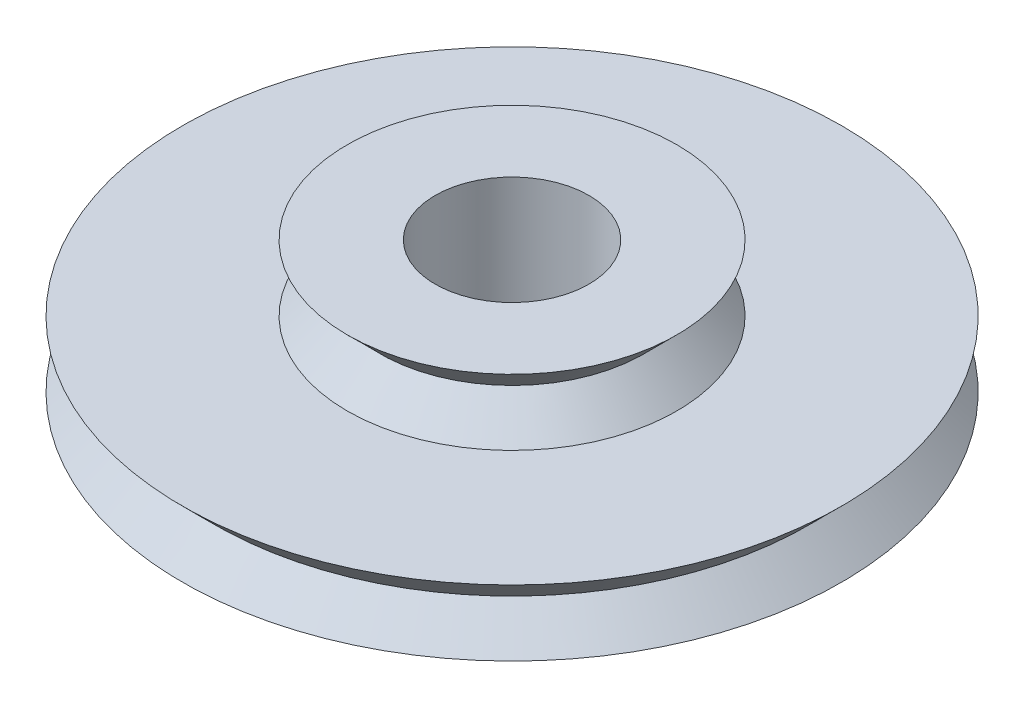
ISO-10303-21;
HEADER;
FILE_DESCRIPTION(('STEP AP214'),'2;1');
FILE_NAME('part.step','',(''),(''),'','','');
FILE_SCHEMA(('AUTOMOTIVE_DESIGN { 1 0 10303 214 1 1 1 1 }'));
ENDSEC;
DATA;
#1=APPLICATION_CONTEXT('core data for automotive mechanical design processes');
#2=APPLICATION_PROTOCOL_DEFINITION('international standard','automotive_design',2000,#1);
#3=PRODUCT_CONTEXT('',#1,'mechanical');
#4=PRODUCT('Part','Part','',(#3));
#5=PRODUCT_RELATED_PRODUCT_CATEGORY('part','',(#4));
#6=PRODUCT_DEFINITION_FORMATION('','',#4);
#7=PRODUCT_DEFINITION_CONTEXT('part definition',#1,'design');
#8=PRODUCT_DEFINITION('design','',#6,#7);
#9=PRODUCT_DEFINITION_SHAPE('','',#8);
#10=(LENGTH_UNIT() NAMED_UNIT(*) SI_UNIT(.MILLI.,.METRE.));
#11=(NAMED_UNIT(*) PLANE_ANGLE_UNIT() SI_UNIT($,.RADIAN.));
#12=(NAMED_UNIT(*) SI_UNIT($,.STERADIAN.) SOLID_ANGLE_UNIT());
#13=UNCERTAINTY_MEASURE_WITH_UNIT(LENGTH_MEASURE(1.E-05),#10,'distance_accuracy_value','');
#14=(GEOMETRIC_REPRESENTATION_CONTEXT(3) GLOBAL_UNCERTAINTY_ASSIGNED_CONTEXT((#13)) GLOBAL_UNIT_ASSIGNED_CONTEXT((#10,
#11,#12)) REPRESENTATION_CONTEXT('',''));
#15=CARTESIAN_POINT('',(0.,0.,0.));
#16=DIRECTION('',(0.,0.,1.));
#17=DIRECTION('',(1.,0.,0.));
#18=AXIS2_PLACEMENT_3D('',#15,#16,#17);
#19=CARTESIAN_POINT('',(-3.5,0.,0.));
#20=DIRECTION('',(0.,1.,0.));
#21=DIRECTION('',(0.,0.,1.));
#22=AXIS2_PLACEMENT_3D('',#19,#20,#21);
#23=PLANE('',#22);
#24=CARTESIAN_POINT('',(0.,0.,0.));
#25=DIRECTION('',(0.,-1.,0.));
#26=DIRECTION('',(0.,0.,-1.));
#27=AXIS2_PLACEMENT_3D('',#24,#25,#26);
#28=CIRCLE('',#27,3.5);
#29=CARTESIAN_POINT('',(0.,0.,-3.5));
#30=VERTEX_POINT('',#29);
#31=EDGE_CURVE('E10',#30,#30,#28,.T.);
#32=ORIENTED_EDGE('',*,*,#31,.F.);
#33=EDGE_LOOP('',(#32));
#34=FACE_BOUND('',#33,.T.);
#35=CARTESIAN_POINT('',(0.,0.,0.));
#36=DIRECTION('',(0.,-1.,0.));
#37=DIRECTION('',(0.,0.,-1.));
#38=AXIS2_PLACEMENT_3D('',#35,#36,#37);
#39=CIRCLE('',#38,15.);
#40=CARTESIAN_POINT('',(0.,0.,-15.));
#41=VERTEX_POINT('',#40);
#42=EDGE_CURVE('E63',#41,#41,#39,.T.);
#43=ORIENTED_EDGE('',*,*,#42,.T.);
#44=EDGE_LOOP('',(#43));
#45=FACE_BOUND('',#44,.T.);
#46=ADVANCED_FACE('F35',(#34,#45),#23,.F.);
#47=CARTESIAN_POINT('',(0.,0.,0.));
#48=DIRECTION('',(0.,-1.,0.));
#49=DIRECTION('',(0.,0.,-1.));
#50=AXIS2_PLACEMENT_3D('',#47,#48,#49);
#51=CYLINDRICAL_SURFACE('',#50,3.5);
#52=CARTESIAN_POINT('',(0.,6.00000000000003,0.));
#53=DIRECTION('',(0.,-1.,0.));
#54=DIRECTION('',(0.,0.,-1.));
#55=AXIS2_PLACEMENT_3D('',#52,#53,#54);
#56=CIRCLE('',#55,3.5);
#57=CARTESIAN_POINT('',(0.,6.00000000000003,-3.5));
#58=VERTEX_POINT('',#57);
#59=EDGE_CURVE('E41',#58,#58,#56,.T.);
#60=ORIENTED_EDGE('',*,*,#59,.F.);
#61=EDGE_LOOP('',(#60));
#62=FACE_BOUND('',#61,.T.);
#63=ORIENTED_EDGE('',*,*,#31,.T.);
#64=EDGE_LOOP('',(#63));
#65=FACE_BOUND('',#64,.T.);
#66=ADVANCED_FACE('F100',(#62,#65),#51,.F.);
#67=CARTESIAN_POINT('',(-7.5,6.00000000000003,0.));
#68=DIRECTION('',(0.,-1.,0.));
#69=DIRECTION('',(0.,0.,-1.));
#70=AXIS2_PLACEMENT_3D('',#67,#68,#69);
#71=PLANE('',#70);
#72=CARTESIAN_POINT('',(0.,6.00000000000003,0.));
#73=DIRECTION('',(0.,-1.,0.));
#74=DIRECTION('',(0.,0.,-1.));
#75=AXIS2_PLACEMENT_3D('',#72,#73,#74);
#76=CIRCLE('',#75,7.5);
#77=CARTESIAN_POINT('',(0.,6.00000000000003,-7.5));
#78=VERTEX_POINT('',#77);
#79=EDGE_CURVE('E45',#78,#78,#76,.T.);
#80=ORIENTED_EDGE('',*,*,#79,.F.);
#81=EDGE_LOOP('',(#80));
#82=FACE_BOUND('',#81,.T.);
#83=ORIENTED_EDGE('',*,*,#59,.T.);
#84=EDGE_LOOP('',(#83));
#85=FACE_BOUND('',#84,.T.);
#86=ADVANCED_FACE('F95',(#82,#85),#71,.F.);
#87=CARTESIAN_POINT('',(0.,6.00000000000003,0.));
#88=DIRECTION('',(0.,1.,0.));
#89=DIRECTION('',(0.,0.,1.));
#90=AXIS2_PLACEMENT_3D('',#87,#88,#89);
#91=CONICAL_SURFACE('',#90,7.5,0.78539816339745);
#92=CARTESIAN_POINT('',(0.,4.50000000000004,0.));
#93=DIRECTION('',(0.,-1.,0.));
#94=DIRECTION('',(0.,0.,-1.));
#95=AXIS2_PLACEMENT_3D('',#92,#93,#94);
#96=CIRCLE('',#95,6.);
#97=CARTESIAN_POINT('',(0.,4.50000000000004,-6.));
#98=VERTEX_POINT('',#97);
#99=EDGE_CURVE('E49',#98,#98,#96,.T.);
#100=ORIENTED_EDGE('',*,*,#99,.F.);
#101=EDGE_LOOP('',(#100));
#102=FACE_BOUND('',#101,.T.);
#103=ORIENTED_EDGE('',*,*,#79,.T.);
#104=EDGE_LOOP('',(#103));
#105=FACE_BOUND('',#104,.T.);
#106=ADVANCED_FACE('F89',(#102,#105),#91,.T.);
#107=CARTESIAN_POINT('',(0.,4.50000000000004,0.));
#108=DIRECTION('',(0.,-1.,0.));
#109=DIRECTION('',(0.,0.,-1.));
#110=AXIS2_PLACEMENT_3D('',#107,#108,#109);
#111=CONICAL_SURFACE('',#110,6.,0.785398163397448);
#112=CARTESIAN_POINT('',(0.,3.00000000000004,0.));
#113=DIRECTION('',(0.,-1.,0.));
#114=DIRECTION('',(0.,0.,-1.));
#115=AXIS2_PLACEMENT_3D('',#112,#113,#114);
#116=CIRCLE('',#115,7.5);
#117=CARTESIAN_POINT('',(0.,3.00000000000004,-7.5));
#118=VERTEX_POINT('',#117);
#119=EDGE_CURVE('E54',#118,#118,#116,.T.);
#120=ORIENTED_EDGE('',*,*,#119,.F.);
#121=EDGE_LOOP('',(#120));
#122=FACE_BOUND('',#121,.T.);
#123=ORIENTED_EDGE('',*,*,#99,.T.);
#124=EDGE_LOOP('',(#123));
#125=FACE_BOUND('',#124,.T.);
#126=ADVANCED_FACE('F83',(#122,#125),#111,.T.);
#127=CARTESIAN_POINT('',(-15.,3.00000000000003,0.));
#128=DIRECTION('',(0.,-1.,0.));
#129=DIRECTION('',(0.,0.,-1.));
#130=AXIS2_PLACEMENT_3D('',#127,#128,#129);
#131=PLANE('',#130);
#132=CARTESIAN_POINT('',(0.,3.00000000000003,0.));
#133=DIRECTION('',(0.,-1.,0.));
#134=DIRECTION('',(0.,0.,-1.));
#135=AXIS2_PLACEMENT_3D('',#132,#133,#134);
#136=CIRCLE('',#135,15.);
#137=CARTESIAN_POINT('',(0.,3.00000000000003,-15.));
#138=VERTEX_POINT('',#137);
#139=EDGE_CURVE('E57',#138,#138,#136,.T.);
#140=ORIENTED_EDGE('',*,*,#139,.F.);
#141=EDGE_LOOP('',(#140));
#142=FACE_BOUND('',#141,.T.);
#143=ORIENTED_EDGE('',*,*,#119,.T.);
#144=EDGE_LOOP('',(#143));
#145=FACE_BOUND('',#144,.T.);
#146=ADVANCED_FACE('F77',(#142,#145),#131,.F.);
#147=CARTESIAN_POINT('',(0.,3.00000000000003,0.));
#148=DIRECTION('',(0.,1.,0.));
#149=DIRECTION('',(0.,0.,1.));
#150=AXIS2_PLACEMENT_3D('',#147,#148,#149);
#151=CONICAL_SURFACE('',#150,15.,0.78539816339741);
#152=CARTESIAN_POINT('',(0.,1.49999999999993,0.));
#153=DIRECTION('',(0.,-1.,0.));
#154=DIRECTION('',(0.,0.,-1.));
#155=AXIS2_PLACEMENT_3D('',#152,#153,#154);
#156=CIRCLE('',#155,13.5);
#157=CARTESIAN_POINT('',(0.,1.49999999999993,-13.5));
#158=VERTEX_POINT('',#157);
#159=EDGE_CURVE('E60',#158,#158,#156,.T.);
#160=ORIENTED_EDGE('',*,*,#159,.F.);
#161=EDGE_LOOP('',(#160));
#162=FACE_BOUND('',#161,.T.);
#163=ORIENTED_EDGE('',*,*,#139,.T.);
#164=EDGE_LOOP('',(#163));
#165=FACE_BOUND('',#164,.T.);
#166=ADVANCED_FACE('F71',(#162,#165),#151,.T.);
#167=CARTESIAN_POINT('',(0.,1.49999999999993,0.));
#168=DIRECTION('',(0.,-1.,0.));
#169=DIRECTION('',(0.,0.,-1.));
#170=AXIS2_PLACEMENT_3D('',#167,#168,#169);
#171=CONICAL_SURFACE('',#170,13.5,0.785398163397444);
#172=ORIENTED_EDGE('',*,*,#42,.F.);
#173=EDGE_LOOP('',(#172));
#174=FACE_BOUND('',#173,.T.);
#175=ORIENTED_EDGE('',*,*,#159,.T.);
#176=EDGE_LOOP('',(#175));
#177=FACE_BOUND('',#176,.T.);
#178=ADVANCED_FACE('F68',(#174,#177),#171,.T.);
#179=CLOSED_SHELL('',(#46,#66,#86,#106,#126,#146,#166,#178));
#180=MANIFOLD_SOLID_BREP('B2',#179);
#181=ADVANCED_BREP_SHAPE_REPRESENTATION('',(#18,#180),#14);
#182=SHAPE_DEFINITION_REPRESENTATION(#9,#181);
ENDSEC;
END-ISO-10303-21;
